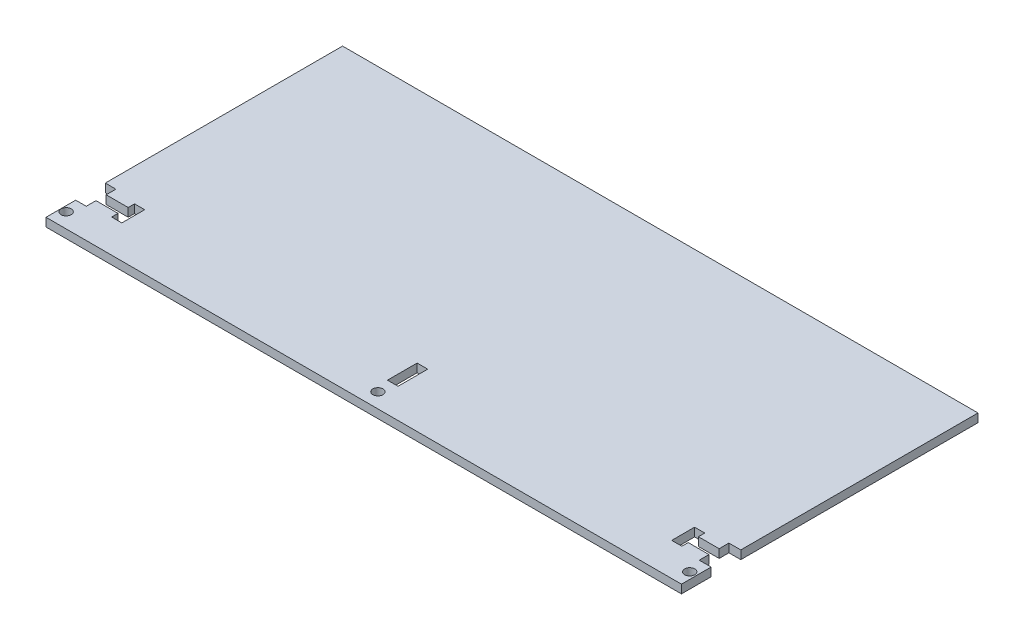
ISO-10303-21;
HEADER;
FILE_DESCRIPTION(('STEP AP214'),'2;1');
FILE_NAME('part.step','',(''),(''),'','','');
FILE_SCHEMA(('AUTOMOTIVE_DESIGN { 1 0 10303 214 1 1 1 1 }'));
ENDSEC;
DATA;
#1=APPLICATION_CONTEXT('core data for automotive mechanical design processes');
#2=APPLICATION_PROTOCOL_DEFINITION('international standard','automotive_design',2000,#1);
#3=PRODUCT_CONTEXT('',#1,'mechanical');
#4=PRODUCT('Part','Part','',(#3));
#5=PRODUCT_RELATED_PRODUCT_CATEGORY('part','',(#4));
#6=PRODUCT_DEFINITION_FORMATION('','',#4);
#7=PRODUCT_DEFINITION_CONTEXT('part definition',#1,'design');
#8=PRODUCT_DEFINITION('design','',#6,#7);
#9=PRODUCT_DEFINITION_SHAPE('','',#8);
#10=(LENGTH_UNIT() NAMED_UNIT(*) SI_UNIT(.MILLI.,.METRE.));
#11=(NAMED_UNIT(*) PLANE_ANGLE_UNIT() SI_UNIT($,.RADIAN.));
#12=(NAMED_UNIT(*) SI_UNIT($,.STERADIAN.) SOLID_ANGLE_UNIT());
#13=UNCERTAINTY_MEASURE_WITH_UNIT(LENGTH_MEASURE(1.E-05),#10,'distance_accuracy_value','');
#14=(GEOMETRIC_REPRESENTATION_CONTEXT(3) GLOBAL_UNCERTAINTY_ASSIGNED_CONTEXT((#13)) GLOBAL_UNIT_ASSIGNED_CONTEXT((#10,
#11,#12)) REPRESENTATION_CONTEXT('',''));
#15=CARTESIAN_POINT('',(0.,0.,0.));
#16=DIRECTION('',(0.,0.,1.));
#17=DIRECTION('',(1.,0.,0.));
#18=AXIS2_PLACEMENT_3D('',#15,#16,#17);
#19=CARTESIAN_POINT('',(96.647,2.54,0.));
#20=DIRECTION('',(1.,0.,0.));
#21=DIRECTION('',(0.,0.,-1.));
#22=AXIS2_PLACEMENT_3D('',#19,#20,#21);
#23=PLANE('',#22);
#24=DIRECTION('',(0.,0.,1.));
#25=VECTOR('',#24,1.);
#26=CARTESIAN_POINT('',(96.647,0.,0.));
#27=LINE('',#26,#25);
#28=CARTESIAN_POINT('',(96.647,0.,71.12));
#29=VERTEX_POINT('',#28);
#30=CARTESIAN_POINT('',(96.647,0.,80.01));
#31=VERTEX_POINT('',#30);
#32=EDGE_CURVE('E389',#29,#31,#27,.T.);
#33=ORIENTED_EDGE('',*,*,#32,.T.);
#34=DIRECTION('',(0.,-1.,0.));
#35=VECTOR('',#34,1.);
#36=CARTESIAN_POINT('',(96.647,2.54,80.01));
#37=LINE('',#36,#35);
#38=CARTESIAN_POINT('',(96.647,2.54,80.01));
#39=VERTEX_POINT('',#38);
#40=EDGE_CURVE('E11',#39,#31,#37,.T.);
#41=ORIENTED_EDGE('',*,*,#40,.F.);
#42=DIRECTION('',(0.,0.,1.));
#43=VECTOR('',#42,1.);
#44=CARTESIAN_POINT('',(96.647,2.54,0.));
#45=LINE('',#44,#43);
#46=CARTESIAN_POINT('',(96.647,2.54,71.12));
#47=VERTEX_POINT('',#46);
#48=EDGE_CURVE('E274',#47,#39,#45,.T.);
#49=ORIENTED_EDGE('',*,*,#48,.F.);
#50=DIRECTION('',(0.,-1.,0.));
#51=VECTOR('',#50,1.);
#52=CARTESIAN_POINT('',(96.647,2.54,71.12));
#53=LINE('',#52,#51);
#54=EDGE_CURVE('E405',#47,#29,#53,.T.);
#55=ORIENTED_EDGE('',*,*,#54,.T.);
#56=EDGE_LOOP('',(#33,#41,#49,#55));
#57=FACE_BOUND('',#56,.T.);
#58=ADVANCED_FACE('F41',(#57),#23,.F.);
#59=CARTESIAN_POINT('',(0.,2.54,80.01));
#60=DIRECTION('',(0.,0.,-1.));
#61=DIRECTION('',(-1.,0.,0.));
#62=AXIS2_PLACEMENT_3D('',#59,#60,#61);
#63=PLANE('',#62);
#64=DIRECTION('',(1.,0.,0.));
#65=VECTOR('',#64,1.);
#66=CARTESIAN_POINT('',(0.,0.,80.01));
#67=LINE('',#66,#65);
#68=CARTESIAN_POINT('',(93.472,0.,80.01));
#69=VERTEX_POINT('',#68);
#70=EDGE_CURVE('E263',#69,#31,#67,.T.);
#71=ORIENTED_EDGE('',*,*,#70,.F.);
#72=DIRECTION('',(0.,-1.,0.));
#73=VECTOR('',#72,1.);
#74=CARTESIAN_POINT('',(93.472,2.54,80.01));
#75=LINE('',#74,#73);
#76=CARTESIAN_POINT('',(93.472,2.54,80.01));
#77=VERTEX_POINT('',#76);
#78=EDGE_CURVE('E52',#77,#69,#75,.T.);
#79=ORIENTED_EDGE('',*,*,#78,.F.);
#80=DIRECTION('',(1.,0.,0.));
#81=VECTOR('',#80,1.);
#82=CARTESIAN_POINT('',(0.,2.54,80.01));
#83=LINE('',#82,#81);
#84=EDGE_CURVE('E261',#77,#39,#83,.T.);
#85=ORIENTED_EDGE('',*,*,#84,.T.);
#86=ORIENTED_EDGE('',*,*,#40,.T.);
#87=EDGE_LOOP('',(#71,#79,#85,#86));
#88=FACE_BOUND('',#87,.T.);
#89=ADVANCED_FACE('F260',(#88),#63,.T.);
#90=CARTESIAN_POINT('',(93.472,2.54,0.));
#91=DIRECTION('',(1.,0.,0.));
#92=DIRECTION('',(0.,0.,-1.));
#93=AXIS2_PLACEMENT_3D('',#90,#91,#92);
#94=PLANE('',#93);
#95=DIRECTION('',(0.,0.,1.));
#96=VECTOR('',#95,1.);
#97=CARTESIAN_POINT('',(93.472,0.,0.));
#98=LINE('',#97,#96);
#99=CARTESIAN_POINT('',(93.472,0.,71.12));
#100=VERTEX_POINT('',#99);
#101=EDGE_CURVE('E395',#100,#69,#98,.T.);
#102=ORIENTED_EDGE('',*,*,#101,.F.);
#103=DIRECTION('',(0.,-1.,0.));
#104=VECTOR('',#103,1.);
#105=CARTESIAN_POINT('',(93.472,2.54,71.12));
#106=LINE('',#105,#104);
#107=CARTESIAN_POINT('',(93.472,2.54,71.12));
#108=VERTEX_POINT('',#107);
#109=EDGE_CURVE('E160',#108,#100,#106,.T.);
#110=ORIENTED_EDGE('',*,*,#109,.F.);
#111=DIRECTION('',(0.,0.,1.));
#112=VECTOR('',#111,1.);
#113=CARTESIAN_POINT('',(93.472,2.54,0.));
#114=LINE('',#113,#112);
#115=EDGE_CURVE('E272',#108,#77,#114,.T.);
#116=ORIENTED_EDGE('',*,*,#115,.T.);
#117=ORIENTED_EDGE('',*,*,#78,.T.);
#118=EDGE_LOOP('',(#102,#110,#116,#117));
#119=FACE_BOUND('',#118,.T.);
#120=ADVANCED_FACE('F278',(#119),#94,.T.);
#121=CARTESIAN_POINT('',(0.,2.54,88.9));
#122=DIRECTION('',(0.,0.,-1.));
#123=DIRECTION('',(-1.,0.,0.));
#124=AXIS2_PLACEMENT_3D('',#121,#122,#123);
#125=PLANE('',#124);
#126=DIRECTION('',(1.,0.,0.));
#127=VECTOR('',#126,1.);
#128=CARTESIAN_POINT('',(0.,0.,88.9));
#129=LINE('',#128,#127);
#130=CARTESIAN_POINT('',(0.,0.,88.9));
#131=VERTEX_POINT('',#130);
#132=CARTESIAN_POINT('',(190.5,0.,88.9));
#133=VERTEX_POINT('',#132);
#134=EDGE_CURVE('E294',#131,#133,#129,.T.);
#135=ORIENTED_EDGE('',*,*,#134,.T.);
#136=DIRECTION('',(0.,-1.,0.));
#137=VECTOR('',#136,1.);
#138=CARTESIAN_POINT('',(190.5,2.54,88.9));
#139=LINE('',#138,#137);
#140=CARTESIAN_POINT('',(190.5,2.54,88.9));
#141=VERTEX_POINT('',#140);
#142=EDGE_CURVE('E45',#141,#133,#139,.T.);
#143=ORIENTED_EDGE('',*,*,#142,.F.);
#144=DIRECTION('',(1.,0.,0.));
#145=VECTOR('',#144,1.);
#146=CARTESIAN_POINT('',(0.,2.54,88.9));
#147=LINE('',#146,#145);
#148=CARTESIAN_POINT('',(0.,2.54,88.9));
#149=VERTEX_POINT('',#148);
#150=EDGE_CURVE('E172',#149,#141,#147,.T.);
#151=ORIENTED_EDGE('',*,*,#150,.F.);
#152=DIRECTION('',(0.,-1.,0.));
#153=VECTOR('',#152,1.);
#154=CARTESIAN_POINT('',(0.,2.54,88.9));
#155=LINE('',#154,#153);
#156=EDGE_CURVE('E289',#149,#131,#155,.T.);
#157=ORIENTED_EDGE('',*,*,#156,.T.);
#158=EDGE_LOOP('',(#135,#143,#151,#157));
#159=FACE_BOUND('',#158,.T.);
#160=ADVANCED_FACE('F506',(#159),#125,.F.);
#161=CARTESIAN_POINT('',(190.5,2.54,0.));
#162=DIRECTION('',(1.,0.,0.));
#163=DIRECTION('',(0.,0.,-1.));
#164=AXIS2_PLACEMENT_3D('',#161,#162,#163);
#165=PLANE('',#164);
#166=DIRECTION('',(0.,0.,1.));
#167=VECTOR('',#166,1.);
#168=CARTESIAN_POINT('',(190.5,0.,0.));
#169=LINE('',#168,#167);
#170=CARTESIAN_POINT('',(190.5,0.,80.01));
#171=VERTEX_POINT('',#170);
#172=EDGE_CURVE('E298',#171,#133,#169,.T.);
#173=ORIENTED_EDGE('',*,*,#172,.F.);
#174=DIRECTION('',(0.,-1.,0.));
#175=VECTOR('',#174,1.);
#176=CARTESIAN_POINT('',(190.5,2.54,80.01));
#177=LINE('',#176,#175);
#178=CARTESIAN_POINT('',(190.5,2.54,80.01));
#179=VERTEX_POINT('',#178);
#180=EDGE_CURVE('E493',#179,#171,#177,.T.);
#181=ORIENTED_EDGE('',*,*,#180,.F.);
#182=DIRECTION('',(0.,0.,1.));
#183=VECTOR('',#182,1.);
#184=CARTESIAN_POINT('',(190.5,2.54,0.));
#185=LINE('',#184,#183);
#186=EDGE_CURVE('E503',#179,#141,#185,.T.);
#187=ORIENTED_EDGE('',*,*,#186,.T.);
#188=ORIENTED_EDGE('',*,*,#142,.T.);
#189=EDGE_LOOP('',(#173,#181,#187,#188));
#190=FACE_BOUND('',#189,.T.);
#191=ADVANCED_FACE('F502',(#190),#165,.T.);
#192=CARTESIAN_POINT('',(0.,2.54,80.01));
#193=DIRECTION('',(0.,0.,-1.));
#194=DIRECTION('',(-1.,0.,0.));
#195=AXIS2_PLACEMENT_3D('',#192,#193,#194);
#196=PLANE('',#195);
#197=DIRECTION('',(1.,0.,0.));
#198=VECTOR('',#197,1.);
#199=CARTESIAN_POINT('',(0.,0.,80.01));
#200=LINE('',#199,#198);
#201=CARTESIAN_POINT('',(186.944,0.,80.01));
#202=VERTEX_POINT('',#201);
#203=EDGE_CURVE('E302',#202,#171,#200,.T.);
#204=ORIENTED_EDGE('',*,*,#203,.F.);
#205=DIRECTION('',(0.,-1.,0.));
#206=VECTOR('',#205,1.);
#207=CARTESIAN_POINT('',(186.944,2.54,80.01));
#208=LINE('',#207,#206);
#209=CARTESIAN_POINT('',(186.944,2.54,80.01));
#210=VERTEX_POINT('',#209);
#211=EDGE_CURVE('E491',#210,#202,#208,.T.);
#212=ORIENTED_EDGE('',*,*,#211,.F.);
#213=DIRECTION('',(1.,0.,0.));
#214=VECTOR('',#213,1.);
#215=CARTESIAN_POINT('',(0.,2.54,80.01));
#216=LINE('',#215,#214);
#217=EDGE_CURVE('E516',#210,#179,#216,.T.);
#218=ORIENTED_EDGE('',*,*,#217,.T.);
#219=ORIENTED_EDGE('',*,*,#180,.T.);
#220=EDGE_LOOP('',(#204,#212,#218,#219));
#221=FACE_BOUND('',#220,.T.);
#222=ADVANCED_FACE('F514',(#221),#196,.T.);
#223=CARTESIAN_POINT('',(186.944,2.54,0.));
#224=DIRECTION('',(1.,0.,0.));
#225=DIRECTION('',(0.,0.,-1.));
#226=AXIS2_PLACEMENT_3D('',#223,#224,#225);
#227=PLANE('',#226);
#228=DIRECTION('',(0.,0.,1.));
#229=VECTOR('',#228,1.);
#230=CARTESIAN_POINT('',(186.944,0.,0.));
#231=LINE('',#230,#229);
#232=CARTESIAN_POINT('',(186.944,0.,77.089));
#233=VERTEX_POINT('',#232);
#234=EDGE_CURVE('E306',#233,#202,#231,.T.);
#235=ORIENTED_EDGE('',*,*,#234,.F.);
#236=DIRECTION('',(0.,-1.,0.));
#237=VECTOR('',#236,1.);
#238=CARTESIAN_POINT('',(186.944,2.54,77.089));
#239=LINE('',#238,#237);
#240=CARTESIAN_POINT('',(186.944,2.54,77.089));
#241=VERTEX_POINT('',#240);
#242=EDGE_CURVE('E488',#241,#233,#239,.T.);
#243=ORIENTED_EDGE('',*,*,#242,.F.);
#244=DIRECTION('',(0.,0.,1.));
#245=VECTOR('',#244,1.);
#246=CARTESIAN_POINT('',(186.944,2.54,0.));
#247=LINE('',#246,#245);
#248=EDGE_CURVE('E521',#241,#210,#247,.T.);
#249=ORIENTED_EDGE('',*,*,#248,.T.);
#250=ORIENTED_EDGE('',*,*,#211,.T.);
#251=EDGE_LOOP('',(#235,#243,#249,#250));
#252=FACE_BOUND('',#251,.T.);
#253=ADVANCED_FACE('F524',(#252),#227,.T.);
#254=CARTESIAN_POINT('',(1.1083969999136E-13,2.54,77.0890000000002));
#255=DIRECTION('',(0.,0.,1.));
#256=DIRECTION('',(1.,0.,0.));
#257=AXIS2_PLACEMENT_3D('',#254,#255,#256);
#258=PLANE('',#257);
#259=DIRECTION('',(-1.,0.,0.));
#260=VECTOR('',#259,1.);
#261=CARTESIAN_POINT('',(1.1083969999136E-13,0.,77.0890000000002));
#262=LINE('',#261,#260);
#263=CARTESIAN_POINT('',(180.721,0.,77.089));
#264=VERTEX_POINT('',#263);
#265=EDGE_CURVE('E310',#233,#264,#262,.T.);
#266=ORIENTED_EDGE('',*,*,#265,.T.);
#267=DIRECTION('',(0.,-1.,0.));
#268=VECTOR('',#267,1.);
#269=CARTESIAN_POINT('',(180.721,2.54,77.089));
#270=LINE('',#269,#268);
#271=CARTESIAN_POINT('',(180.721,2.54,77.089));
#272=VERTEX_POINT('',#271);
#273=EDGE_CURVE('E484',#272,#264,#270,.T.);
#274=ORIENTED_EDGE('',*,*,#273,.F.);
#275=DIRECTION('',(-1.,0.,0.));
#276=VECTOR('',#275,1.);
#277=CARTESIAN_POINT('',(1.1083969999136E-13,2.54,77.0890000000002));
#278=LINE('',#277,#276);
#279=EDGE_CURVE('E527',#241,#272,#278,.T.);
#280=ORIENTED_EDGE('',*,*,#279,.F.);
#281=ORIENTED_EDGE('',*,*,#242,.T.);
#282=EDGE_LOOP('',(#266,#274,#280,#281));
#283=FACE_BOUND('',#282,.T.);
#284=ADVANCED_FACE('F733',(#283),#258,.F.);
#285=CARTESIAN_POINT('',(180.721,2.54,0.));
#286=DIRECTION('',(1.,0.,0.));
#287=DIRECTION('',(0.,0.,-1.));
#288=AXIS2_PLACEMENT_3D('',#285,#286,#287);
#289=PLANE('',#288);
#290=DIRECTION('',(0.,0.,1.));
#291=VECTOR('',#290,1.);
#292=CARTESIAN_POINT('',(180.721,0.,0.));
#293=LINE('',#292,#291);
#294=CARTESIAN_POINT('',(180.721,0.,78.994));
#295=VERTEX_POINT('',#294);
#296=EDGE_CURVE('E314',#264,#295,#293,.T.);
#297=ORIENTED_EDGE('',*,*,#296,.T.);
#298=DIRECTION('',(0.,-1.,0.));
#299=VECTOR('',#298,1.);
#300=CARTESIAN_POINT('',(180.721,2.54,78.994));
#301=LINE('',#300,#299);
#302=CARTESIAN_POINT('',(180.721,2.54,78.994));
#303=VERTEX_POINT('',#302);
#304=EDGE_CURVE('E480',#303,#295,#301,.T.);
#305=ORIENTED_EDGE('',*,*,#304,.F.);
#306=DIRECTION('',(0.,0.,1.));
#307=VECTOR('',#306,1.);
#308=CARTESIAN_POINT('',(180.721,2.54,0.));
#309=LINE('',#308,#307);
#310=EDGE_CURVE('E531',#272,#303,#309,.T.);
#311=ORIENTED_EDGE('',*,*,#310,.F.);
#312=ORIENTED_EDGE('',*,*,#273,.T.);
#313=EDGE_LOOP('',(#297,#305,#311,#312));
#314=FACE_BOUND('',#313,.T.);
#315=ADVANCED_FACE('F721',(#314),#289,.F.);
#316=CARTESIAN_POINT('',(3.59666000685859E-13,2.54,78.9940000000008));
#317=DIRECTION('',(0.,0.,1.));
#318=DIRECTION('',(1.,0.,0.));
#319=AXIS2_PLACEMENT_3D('',#316,#317,#318);
#320=PLANE('',#319);
#321=DIRECTION('',(-1.,0.,0.));
#322=VECTOR('',#321,1.);
#323=CARTESIAN_POINT('',(3.59666000685859E-13,0.,78.9940000000008));
#324=LINE('',#323,#322);
#325=CARTESIAN_POINT('',(177.673,0.,78.994));
#326=VERTEX_POINT('',#325);
#327=EDGE_CURVE('E317',#295,#326,#324,.T.);
#328=ORIENTED_EDGE('',*,*,#327,.T.);
#329=DIRECTION('',(0.,-1.,0.));
#330=VECTOR('',#329,1.);
#331=CARTESIAN_POINT('',(177.673,2.54,78.994));
#332=LINE('',#331,#330);
#333=CARTESIAN_POINT('',(177.673,2.54,78.994));
#334=VERTEX_POINT('',#333);
#335=EDGE_CURVE('E477',#334,#326,#332,.T.);
#336=ORIENTED_EDGE('',*,*,#335,.F.);
#337=DIRECTION('',(-1.,0.,0.));
#338=VECTOR('',#337,1.);
#339=CARTESIAN_POINT('',(3.59666000685859E-13,2.54,78.9940000000008));
#340=LINE('',#339,#338);
#341=EDGE_CURVE('E1025',#303,#334,#340,.T.);
#342=ORIENTED_EDGE('',*,*,#341,.F.);
#343=ORIENTED_EDGE('',*,*,#304,.T.);
#344=EDGE_LOOP('',(#328,#336,#342,#343));
#345=FACE_BOUND('',#344,.T.);
#346=ADVANCED_FACE('F728',(#345),#320,.F.);
#347=CARTESIAN_POINT('',(177.673,2.54,0.));
#348=DIRECTION('',(1.,0.,0.));
#349=DIRECTION('',(0.,0.,-1.));
#350=AXIS2_PLACEMENT_3D('',#347,#348,#349);
#351=PLANE('',#350);
#352=DIRECTION('',(0.,0.,1.));
#353=VECTOR('',#352,1.);
#354=CARTESIAN_POINT('',(177.673,0.,0.));
#355=LINE('',#354,#353);
#356=CARTESIAN_POINT('',(177.673,0.,72.1359999999999));
#357=VERTEX_POINT('',#356);
#358=EDGE_CURVE('E322',#357,#326,#355,.T.);
#359=ORIENTED_EDGE('',*,*,#358,.F.);
#360=DIRECTION('',(0.,-1.,0.));
#361=VECTOR('',#360,1.);
#362=CARTESIAN_POINT('',(177.673,2.54,72.1359999999999));
#363=LINE('',#362,#361);
#364=CARTESIAN_POINT('',(177.673,2.54,72.1359999999999));
#365=VERTEX_POINT('',#364);
#366=EDGE_CURVE('E474',#365,#357,#363,.T.);
#367=ORIENTED_EDGE('',*,*,#366,.F.);
#368=DIRECTION('',(0.,0.,1.));
#369=VECTOR('',#368,1.);
#370=CARTESIAN_POINT('',(177.673,2.54,0.));
#371=LINE('',#370,#369);
#372=EDGE_CURVE('E1031',#365,#334,#371,.T.);
#373=ORIENTED_EDGE('',*,*,#372,.T.);
#374=ORIENTED_EDGE('',*,*,#335,.T.);
#375=EDGE_LOOP('',(#359,#367,#373,#374));
#376=FACE_BOUND('',#375,.T.);
#377=ADVANCED_FACE('F724',(#376),#351,.T.);
#378=CARTESIAN_POINT('',(-3.28440978118269E-13,2.54,72.1359999999991));
#379=DIRECTION('',(0.,0.,1.));
#380=DIRECTION('',(1.,0.,0.));
#381=AXIS2_PLACEMENT_3D('',#378,#379,#380);
#382=PLANE('',#381);
#383=DIRECTION('',(-1.,0.,0.));
#384=VECTOR('',#383,1.);
#385=CARTESIAN_POINT('',(-3.28440978118269E-13,0.,72.1359999999991));
#386=LINE('',#385,#384);
#387=CARTESIAN_POINT('',(180.721,0.,72.1359999999999));
#388=VERTEX_POINT('',#387);
#389=EDGE_CURVE('E326',#388,#357,#386,.T.);
#390=ORIENTED_EDGE('',*,*,#389,.F.);
#391=DIRECTION('',(0.,-1.,0.));
#392=VECTOR('',#391,1.);
#393=CARTESIAN_POINT('',(180.721,2.54,72.1359999999999));
#394=LINE('',#393,#392);
#395=CARTESIAN_POINT('',(180.721,2.54,72.1359999999999));
#396=VERTEX_POINT('',#395);
#397=EDGE_CURVE('E471',#396,#388,#394,.T.);
#398=ORIENTED_EDGE('',*,*,#397,.F.);
#399=DIRECTION('',(-1.,0.,0.));
#400=VECTOR('',#399,1.);
#401=CARTESIAN_POINT('',(-3.28440978118269E-13,2.54,72.1359999999991));
#402=LINE('',#401,#400);
#403=EDGE_CURVE('E549',#396,#365,#402,.T.);
#404=ORIENTED_EDGE('',*,*,#403,.T.);
#405=ORIENTED_EDGE('',*,*,#366,.T.);
#406=EDGE_LOOP('',(#390,#398,#404,#405));
#407=FACE_BOUND('',#406,.T.);
#408=ADVANCED_FACE('F719',(#407),#382,.T.);
#409=CARTESIAN_POINT('',(180.721,0.,74.041));
#410=VERTEX_POINT('',#409);
#411=EDGE_CURVE('E318',#388,#410,#293,.T.);
#412=ORIENTED_EDGE('',*,*,#411,.T.);
#413=DIRECTION('',(0.,-1.,0.));
#414=VECTOR('',#413,1.);
#415=CARTESIAN_POINT('',(180.721,2.54,74.041));
#416=LINE('',#415,#414);
#417=CARTESIAN_POINT('',(180.721,2.54,74.041));
#418=VERTEX_POINT('',#417);
#419=EDGE_CURVE('E468',#418,#410,#416,.T.);
#420=ORIENTED_EDGE('',*,*,#419,.F.);
#421=EDGE_CURVE('E544',#396,#418,#309,.T.);
#422=ORIENTED_EDGE('',*,*,#421,.F.);
#423=ORIENTED_EDGE('',*,*,#397,.T.);
#424=EDGE_LOOP('',(#412,#420,#422,#423));
#425=FACE_BOUND('',#424,.T.);
#426=ADVANCED_FACE('F716',(#425),#289,.F.);
#427=CARTESIAN_POINT('',(-1.06457240683629E-13,2.54,74.0409999999998));
#428=DIRECTION('',(0.,0.,1.));
#429=DIRECTION('',(1.,0.,0.));
#430=AXIS2_PLACEMENT_3D('',#427,#428,#429);
#431=PLANE('',#430);
#432=DIRECTION('',(-1.,0.,0.));
#433=VECTOR('',#432,1.);
#434=CARTESIAN_POINT('',(-1.06457240683629E-13,0.,74.0409999999998));
#435=LINE('',#434,#433);
#436=CARTESIAN_POINT('',(186.944,0.,74.041));
#437=VERTEX_POINT('',#436);
#438=EDGE_CURVE('E330',#437,#410,#435,.T.);
#439=ORIENTED_EDGE('',*,*,#438,.F.);
#440=DIRECTION('',(0.,-1.,0.));
#441=VECTOR('',#440,1.);
#442=CARTESIAN_POINT('',(186.944,2.54,74.041));
#443=LINE('',#442,#441);
#444=CARTESIAN_POINT('',(186.944,2.54,74.041));
#445=VERTEX_POINT('',#444);
#446=EDGE_CURVE('E465',#445,#437,#443,.T.);
#447=ORIENTED_EDGE('',*,*,#446,.F.);
#448=DIRECTION('',(-1.,0.,0.));
#449=VECTOR('',#448,1.);
#450=CARTESIAN_POINT('',(-1.06457240683629E-13,2.54,74.0409999999998));
#451=LINE('',#450,#449);
#452=EDGE_CURVE('E536',#445,#418,#451,.T.);
#453=ORIENTED_EDGE('',*,*,#452,.T.);
#454=ORIENTED_EDGE('',*,*,#419,.T.);
#455=EDGE_LOOP('',(#439,#447,#453,#454));
#456=FACE_BOUND('',#455,.T.);
#457=ADVANCED_FACE('F713',(#456),#431,.T.);
#458=CARTESIAN_POINT('',(186.944,0.,71.12));
#459=VERTEX_POINT('',#458);
#460=EDGE_CURVE('E311',#459,#437,#231,.T.);
#461=ORIENTED_EDGE('',*,*,#460,.F.);
#462=DIRECTION('',(0.,-1.,0.));
#463=VECTOR('',#462,1.);
#464=CARTESIAN_POINT('',(186.944,2.54,71.12));
#465=LINE('',#464,#463);
#466=CARTESIAN_POINT('',(186.944,2.54,71.12));
#467=VERTEX_POINT('',#466);
#468=EDGE_CURVE('E462',#467,#459,#465,.T.);
#469=ORIENTED_EDGE('',*,*,#468,.F.);
#470=EDGE_CURVE('E529',#467,#445,#247,.T.);
#471=ORIENTED_EDGE('',*,*,#470,.T.);
#472=ORIENTED_EDGE('',*,*,#446,.T.);
#473=EDGE_LOOP('',(#461,#469,#471,#472));
#474=FACE_BOUND('',#473,.T.);
#475=ADVANCED_FACE('F709',(#474),#227,.T.);
#476=CARTESIAN_POINT('',(3.10862446895046E-13,2.54,71.1200000000008));
#477=DIRECTION('',(0.,0.,-1.));
#478=DIRECTION('',(-1.,0.,0.));
#479=AXIS2_PLACEMENT_3D('',#476,#477,#478);
#480=PLANE('',#479);
#481=DIRECTION('',(1.,0.,0.));
#482=VECTOR('',#481,1.);
#483=CARTESIAN_POINT('',(3.10862446895046E-13,0.,71.1200000000008));
#484=LINE('',#483,#482);
#485=CARTESIAN_POINT('',(190.5,0.,71.12));
#486=VERTEX_POINT('',#485);
#487=EDGE_CURVE('E334',#459,#486,#484,.T.);
#488=ORIENTED_EDGE('',*,*,#487,.T.);
#489=DIRECTION('',(0.,-1.,0.));
#490=VECTOR('',#489,1.);
#491=CARTESIAN_POINT('',(190.5,2.54,71.12));
#492=LINE('',#491,#490);
#493=CARTESIAN_POINT('',(190.5,2.54,71.12));
#494=VERTEX_POINT('',#493);
#495=EDGE_CURVE('E459',#494,#486,#492,.T.);
#496=ORIENTED_EDGE('',*,*,#495,.F.);
#497=DIRECTION('',(1.,0.,0.));
#498=VECTOR('',#497,1.);
#499=CARTESIAN_POINT('',(3.10862446895046E-13,2.54,71.1200000000008));
#500=LINE('',#499,#498);
#501=EDGE_CURVE('E535',#467,#494,#500,.T.);
#502=ORIENTED_EDGE('',*,*,#501,.F.);
#503=ORIENTED_EDGE('',*,*,#468,.T.);
#504=EDGE_LOOP('',(#488,#496,#502,#503));
#505=FACE_BOUND('',#504,.T.);
#506=ADVANCED_FACE('F705',(#505),#480,.F.);
#507=CARTESIAN_POINT('',(190.5,2.54,0.));
#508=DIRECTION('',(1.,0.,0.));
#509=DIRECTION('',(0.,0.,-1.));
#510=AXIS2_PLACEMENT_3D('',#507,#508,#509);
#511=PLANE('',#510);
#512=DIRECTION('',(0.,0.,1.));
#513=VECTOR('',#512,1.);
#514=CARTESIAN_POINT('',(190.5,0.,0.));
#515=LINE('',#514,#513);
#516=CARTESIAN_POINT('',(190.5,0.,0.));
#517=VERTEX_POINT('',#516);
#518=EDGE_CURVE('E338',#517,#486,#515,.T.);
#519=ORIENTED_EDGE('',*,*,#518,.F.);
#520=DIRECTION('',(0.,-1.,0.));
#521=VECTOR('',#520,1.);
#522=CARTESIAN_POINT('',(190.5,2.54,0.));
#523=LINE('',#522,#521);
#524=CARTESIAN_POINT('',(190.5,2.54,0.));
#525=VERTEX_POINT('',#524);
#526=EDGE_CURVE('E456',#525,#517,#523,.T.);
#527=ORIENTED_EDGE('',*,*,#526,.F.);
#528=DIRECTION('',(0.,0.,1.));
#529=VECTOR('',#528,1.);
#530=CARTESIAN_POINT('',(190.5,2.54,0.));
#531=LINE('',#530,#529);
#532=EDGE_CURVE('E541',#525,#494,#531,.T.);
#533=ORIENTED_EDGE('',*,*,#532,.T.);
#534=ORIENTED_EDGE('',*,*,#495,.T.);
#535=EDGE_LOOP('',(#519,#527,#533,#534));
#536=FACE_BOUND('',#535,.T.);
#537=ADVANCED_FACE('F701',(#536),#511,.T.);
#538=CARTESIAN_POINT('',(0.,2.54,0.));
#539=DIRECTION('',(0.,0.,-1.));
#540=DIRECTION('',(-1.,0.,0.));
#541=AXIS2_PLACEMENT_3D('',#538,#539,#540);
#542=PLANE('',#541);
#543=DIRECTION('',(1.,0.,0.));
#544=VECTOR('',#543,1.);
#545=CARTESIAN_POINT('',(0.,0.,0.));
#546=LINE('',#545,#544);
#547=CARTESIAN_POINT('',(0.,0.,0.));
#548=VERTEX_POINT('',#547);
#549=EDGE_CURVE('E342',#548,#517,#546,.T.);
#550=ORIENTED_EDGE('',*,*,#549,.F.);
#551=DIRECTION('',(0.,-1.,0.));
#552=VECTOR('',#551,1.);
#553=CARTESIAN_POINT('',(0.,2.54,0.));
#554=LINE('',#553,#552);
#555=CARTESIAN_POINT('',(0.,2.54,0.));
#556=VERTEX_POINT('',#555);
#557=EDGE_CURVE('E453',#556,#548,#554,.T.);
#558=ORIENTED_EDGE('',*,*,#557,.F.);
#559=DIRECTION('',(1.,0.,0.));
#560=VECTOR('',#559,1.);
#561=CARTESIAN_POINT('',(0.,2.54,0.));
#562=LINE('',#561,#560);
#563=EDGE_CURVE('E557',#556,#525,#562,.T.);
#564=ORIENTED_EDGE('',*,*,#563,.T.);
#565=ORIENTED_EDGE('',*,*,#526,.T.);
#566=EDGE_LOOP('',(#550,#558,#564,#565));
#567=FACE_BOUND('',#566,.T.);
#568=ADVANCED_FACE('F698',(#567),#542,.T.);
#569=CARTESIAN_POINT('',(0.,2.54,0.));
#570=DIRECTION('',(1.,0.,0.));
#571=DIRECTION('',(0.,0.,-1.));
#572=AXIS2_PLACEMENT_3D('',#569,#570,#571);
#573=PLANE('',#572);
#574=DIRECTION('',(0.,0.,1.));
#575=VECTOR('',#574,1.);
#576=CARTESIAN_POINT('',(0.,0.,0.));
#577=LINE('',#576,#575);
#578=CARTESIAN_POINT('',(0.,0.,71.12));
#579=VERTEX_POINT('',#578);
#580=EDGE_CURVE('E346',#548,#579,#577,.T.);
#581=ORIENTED_EDGE('',*,*,#580,.T.);
#582=DIRECTION('',(0.,-1.,0.));
#583=VECTOR('',#582,1.);
#584=CARTESIAN_POINT('',(0.,2.54,71.12));
#585=LINE('',#584,#583);
#586=CARTESIAN_POINT('',(0.,2.54,71.12));
#587=VERTEX_POINT('',#586);
#588=EDGE_CURVE('E449',#587,#579,#585,.T.);
#589=ORIENTED_EDGE('',*,*,#588,.F.);
#590=DIRECTION('',(0.,0.,1.));
#591=VECTOR('',#590,1.);
#592=CARTESIAN_POINT('',(0.,2.54,0.));
#593=LINE('',#592,#591);
#594=EDGE_CURVE('E561',#556,#587,#593,.T.);
#595=ORIENTED_EDGE('',*,*,#594,.F.);
#596=ORIENTED_EDGE('',*,*,#557,.T.);
#597=EDGE_LOOP('',(#581,#589,#595,#596));
#598=FACE_BOUND('',#597,.T.);
#599=ADVANCED_FACE('F667',(#598),#573,.F.);
#600=CARTESIAN_POINT('',(3.10862446895044E-13,2.54,71.12));
#601=DIRECTION('',(0.,0.,-1.));
#602=DIRECTION('',(-1.,0.,0.));
#603=AXIS2_PLACEMENT_3D('',#600,#601,#602);
#604=PLANE('',#603);
#605=DIRECTION('',(1.,0.,0.));
#606=VECTOR('',#605,1.);
#607=CARTESIAN_POINT('',(3.10862446895044E-13,0.,71.12));
#608=LINE('',#607,#606);
#609=CARTESIAN_POINT('',(3.17500000000001,0.,71.12));
#610=VERTEX_POINT('',#609);
#611=EDGE_CURVE('E349',#579,#610,#608,.T.);
#612=ORIENTED_EDGE('',*,*,#611,.T.);
#613=DIRECTION('',(0.,-1.,0.));
#614=VECTOR('',#613,1.);
#615=CARTESIAN_POINT('',(3.17500000000001,2.54,71.12));
#616=LINE('',#615,#614);
#617=CARTESIAN_POINT('',(3.17500000000001,2.54,71.12));
#618=VERTEX_POINT('',#617);
#619=EDGE_CURVE('E445',#618,#610,#616,.T.);
#620=ORIENTED_EDGE('',*,*,#619,.F.);
#621=DIRECTION('',(1.,0.,0.));
#622=VECTOR('',#621,1.);
#623=CARTESIAN_POINT('',(3.10862446895044E-13,2.54,71.12));
#624=LINE('',#623,#622);
#625=EDGE_CURVE('E564',#587,#618,#624,.T.);
#626=ORIENTED_EDGE('',*,*,#625,.F.);
#627=ORIENTED_EDGE('',*,*,#588,.T.);
#628=EDGE_LOOP('',(#612,#620,#626,#627));
#629=FACE_BOUND('',#628,.T.);
#630=ADVANCED_FACE('F694',(#629),#604,.F.);
#631=CARTESIAN_POINT('',(3.17499999999994,2.54,0.));
#632=DIRECTION('',(1.,0.,0.));
#633=DIRECTION('',(0.,0.,-1.));
#634=AXIS2_PLACEMENT_3D('',#631,#632,#633);
#635=PLANE('',#634);
#636=DIRECTION('',(0.,0.,1.));
#637=VECTOR('',#636,1.);
#638=CARTESIAN_POINT('',(3.17499999999994,0.,0.));
#639=LINE('',#638,#637);
#640=CARTESIAN_POINT('',(3.17500000000001,0.,74.041));
#641=VERTEX_POINT('',#640);
#642=EDGE_CURVE('E353',#610,#641,#639,.T.);
#643=ORIENTED_EDGE('',*,*,#642,.T.);
#644=DIRECTION('',(0.,-1.,0.));
#645=VECTOR('',#644,1.);
#646=CARTESIAN_POINT('',(3.17500000000001,2.54,74.041));
#647=LINE('',#646,#645);
#648=CARTESIAN_POINT('',(3.17500000000001,2.54,74.041));
#649=VERTEX_POINT('',#648);
#650=EDGE_CURVE('E441',#649,#641,#647,.T.);
#651=ORIENTED_EDGE('',*,*,#650,.F.);
#652=DIRECTION('',(0.,0.,1.));
#653=VECTOR('',#652,1.);
#654=CARTESIAN_POINT('',(3.17499999999994,2.54,0.));
#655=LINE('',#654,#653);
#656=EDGE_CURVE('E568',#618,#649,#655,.T.);
#657=ORIENTED_EDGE('',*,*,#656,.F.);
#658=ORIENTED_EDGE('',*,*,#619,.T.);
#659=EDGE_LOOP('',(#643,#651,#657,#658));
#660=FACE_BOUND('',#659,.T.);
#661=ADVANCED_FACE('F672',(#660),#635,.F.);
#662=CARTESIAN_POINT('',(1.06457240683629E-13,2.54,74.041));
#663=DIRECTION('',(0.,0.,-1.));
#664=DIRECTION('',(-1.,0.,0.));
#665=AXIS2_PLACEMENT_3D('',#662,#663,#664);
#666=PLANE('',#665);
#667=DIRECTION('',(1.,0.,0.));
#668=VECTOR('',#667,1.);
#669=CARTESIAN_POINT('',(1.06457240683629E-13,0.,74.041));
#670=LINE('',#669,#668);
#671=CARTESIAN_POINT('',(9.77900000000001,0.,74.041));
#672=VERTEX_POINT('',#671);
#673=EDGE_CURVE('E356',#641,#672,#670,.T.);
#674=ORIENTED_EDGE('',*,*,#673,.T.);
#675=DIRECTION('',(0.,-1.,0.));
#676=VECTOR('',#675,1.);
#677=CARTESIAN_POINT('',(9.77900000000001,2.54,74.041));
#678=LINE('',#677,#676);
#679=CARTESIAN_POINT('',(9.77900000000001,2.54,74.041));
#680=VERTEX_POINT('',#679);
#681=EDGE_CURVE('E438',#680,#672,#678,.T.);
#682=ORIENTED_EDGE('',*,*,#681,.F.);
#683=DIRECTION('',(1.,0.,0.));
#684=VECTOR('',#683,1.);
#685=CARTESIAN_POINT('',(1.06457240683629E-13,2.54,74.041));
#686=LINE('',#685,#684);
#687=EDGE_CURVE('E571',#649,#680,#686,.T.);
#688=ORIENTED_EDGE('',*,*,#687,.F.);
#689=ORIENTED_EDGE('',*,*,#650,.T.);
#690=EDGE_LOOP('',(#674,#682,#688,#689));
#691=FACE_BOUND('',#690,.T.);
#692=ADVANCED_FACE('F690',(#691),#666,.F.);
#693=CARTESIAN_POINT('',(9.77899999999999,2.54,0.));
#694=DIRECTION('',(1.,0.,0.));
#695=DIRECTION('',(0.,0.,-1.));
#696=AXIS2_PLACEMENT_3D('',#693,#694,#695);
#697=PLANE('',#696);
#698=DIRECTION('',(0.,0.,1.));
#699=VECTOR('',#698,1.);
#700=CARTESIAN_POINT('',(9.77899999999999,0.,0.));
#701=LINE('',#700,#699);
#702=CARTESIAN_POINT('',(9.77900000000001,0.,72.136));
#703=VERTEX_POINT('',#702);
#704=EDGE_CURVE('E361',#703,#672,#701,.T.);
#705=ORIENTED_EDGE('',*,*,#704,.F.);
#706=DIRECTION('',(0.,-1.,0.));
#707=VECTOR('',#706,1.);
#708=CARTESIAN_POINT('',(9.77900000000001,2.54,72.136));
#709=LINE('',#708,#707);
#710=CARTESIAN_POINT('',(9.77900000000001,2.54,72.136));
#711=VERTEX_POINT('',#710);
#712=EDGE_CURVE('E435',#711,#703,#709,.T.);
#713=ORIENTED_EDGE('',*,*,#712,.F.);
#714=DIRECTION('',(0.,0.,1.));
#715=VECTOR('',#714,1.);
#716=CARTESIAN_POINT('',(9.77899999999999,2.54,0.));
#717=LINE('',#716,#715);
#718=EDGE_CURVE('E575',#711,#680,#717,.T.);
#719=ORIENTED_EDGE('',*,*,#718,.T.);
#720=ORIENTED_EDGE('',*,*,#681,.T.);
#721=EDGE_LOOP('',(#705,#713,#719,#720));
#722=FACE_BOUND('',#721,.T.);
#723=ADVANCED_FACE('F678',(#722),#697,.T.);
#724=CARTESIAN_POINT('',(0.,2.54,72.136));
#725=DIRECTION('',(0.,0.,-1.));
#726=DIRECTION('',(-1.,0.,0.));
#727=AXIS2_PLACEMENT_3D('',#724,#725,#726);
#728=PLANE('',#727);
#729=DIRECTION('',(1.,0.,0.));
#730=VECTOR('',#729,1.);
#731=CARTESIAN_POINT('',(0.,0.,72.136));
#732=LINE('',#731,#730);
#733=CARTESIAN_POINT('',(12.827,0.,72.136));
#734=VERTEX_POINT('',#733);
#735=EDGE_CURVE('E365',#703,#734,#732,.T.);
#736=ORIENTED_EDGE('',*,*,#735,.T.);
#737=DIRECTION('',(0.,-1.,0.));
#738=VECTOR('',#737,1.);
#739=CARTESIAN_POINT('',(12.827,2.54,72.136));
#740=LINE('',#739,#738);
#741=CARTESIAN_POINT('',(12.827,2.54,72.136));
#742=VERTEX_POINT('',#741);
#743=EDGE_CURVE('E431',#742,#734,#740,.T.);
#744=ORIENTED_EDGE('',*,*,#743,.F.);
#745=DIRECTION('',(1.,0.,0.));
#746=VECTOR('',#745,1.);
#747=CARTESIAN_POINT('',(0.,2.54,72.136));
#748=LINE('',#747,#746);
#749=EDGE_CURVE('E579',#711,#742,#748,.T.);
#750=ORIENTED_EDGE('',*,*,#749,.F.);
#751=ORIENTED_EDGE('',*,*,#712,.T.);
#752=EDGE_LOOP('',(#736,#744,#750,#751));
#753=FACE_BOUND('',#752,.T.);
#754=ADVANCED_FACE('F685',(#753),#728,.F.);
#755=CARTESIAN_POINT('',(12.827,2.54,0.));
#756=DIRECTION('',(1.,0.,0.));
#757=DIRECTION('',(0.,0.,-1.));
#758=AXIS2_PLACEMENT_3D('',#755,#756,#757);
#759=PLANE('',#758);
#760=DIRECTION('',(0.,0.,1.));
#761=VECTOR('',#760,1.);
#762=CARTESIAN_POINT('',(12.827,0.,0.));
#763=LINE('',#762,#761);
#764=CARTESIAN_POINT('',(12.827,0.,78.994));
#765=VERTEX_POINT('',#764);
#766=EDGE_CURVE('E369',#734,#765,#763,.T.);
#767=ORIENTED_EDGE('',*,*,#766,.T.);
#768=DIRECTION('',(0.,-1.,0.));
#769=VECTOR('',#768,1.);
#770=CARTESIAN_POINT('',(12.827,2.54,78.994));
#771=LINE('',#770,#769);
#772=CARTESIAN_POINT('',(12.827,2.54,78.994));
#773=VERTEX_POINT('',#772);
#774=EDGE_CURVE('E428',#773,#765,#771,.T.);
#775=ORIENTED_EDGE('',*,*,#774,.F.);
#776=DIRECTION('',(0.,0.,1.));
#777=VECTOR('',#776,1.);
#778=CARTESIAN_POINT('',(12.827,2.54,0.));
#779=LINE('',#778,#777);
#780=EDGE_CURVE('E583',#742,#773,#779,.T.);
#781=ORIENTED_EDGE('',*,*,#780,.F.);
#782=ORIENTED_EDGE('',*,*,#743,.T.);
#783=EDGE_LOOP('',(#767,#775,#781,#782));
#784=FACE_BOUND('',#783,.T.);
#785=ADVANCED_FACE('F681',(#784),#759,.F.);
#786=CARTESIAN_POINT('',(0.,2.54,78.994));
#787=DIRECTION('',(0.,0.,-1.));
#788=DIRECTION('',(-1.,0.,0.));
#789=AXIS2_PLACEMENT_3D('',#786,#787,#788);
#790=PLANE('',#789);
#791=DIRECTION('',(1.,0.,0.));
#792=VECTOR('',#791,1.);
#793=CARTESIAN_POINT('',(0.,0.,78.994));
#794=LINE('',#793,#792);
#795=CARTESIAN_POINT('',(9.77900000000002,0.,78.994));
#796=VERTEX_POINT('',#795);
#797=EDGE_CURVE('E373',#796,#765,#794,.T.);
#798=ORIENTED_EDGE('',*,*,#797,.F.);
#799=DIRECTION('',(0.,-1.,0.));
#800=VECTOR('',#799,1.);
#801=CARTESIAN_POINT('',(9.77900000000002,2.54,78.994));
#802=LINE('',#801,#800);
#803=CARTESIAN_POINT('',(9.77900000000002,2.54,78.994));
#804=VERTEX_POINT('',#803);
#805=EDGE_CURVE('E425',#804,#796,#802,.T.);
#806=ORIENTED_EDGE('',*,*,#805,.F.);
#807=DIRECTION('',(1.,0.,0.));
#808=VECTOR('',#807,1.);
#809=CARTESIAN_POINT('',(0.,2.54,78.994));
#810=LINE('',#809,#808);
#811=EDGE_CURVE('E586',#804,#773,#810,.T.);
#812=ORIENTED_EDGE('',*,*,#811,.T.);
#813=ORIENTED_EDGE('',*,*,#774,.T.);
#814=EDGE_LOOP('',(#798,#806,#812,#813));
#815=FACE_BOUND('',#814,.T.);
#816=ADVANCED_FACE('F677',(#815),#790,.T.);
#817=CARTESIAN_POINT('',(9.77900000000001,0.,77.089));
#818=VERTEX_POINT('',#817);
#819=EDGE_CURVE('E366',#818,#796,#701,.T.);
#820=ORIENTED_EDGE('',*,*,#819,.F.);
#821=DIRECTION('',(0.,-1.,0.));
#822=VECTOR('',#821,1.);
#823=CARTESIAN_POINT('',(9.77900000000001,2.54,77.089));
#824=LINE('',#823,#822);
#825=CARTESIAN_POINT('',(9.77900000000001,2.54,77.089));
#826=VERTEX_POINT('',#825);
#827=EDGE_CURVE('E422',#826,#818,#824,.T.);
#828=ORIENTED_EDGE('',*,*,#827,.F.);
#829=EDGE_CURVE('E580',#826,#804,#717,.T.);
#830=ORIENTED_EDGE('',*,*,#829,.T.);
#831=ORIENTED_EDGE('',*,*,#805,.T.);
#832=EDGE_LOOP('',(#820,#828,#830,#831));
#833=FACE_BOUND('',#832,.T.);
#834=ADVANCED_FACE('F609',(#833),#697,.T.);
#835=CARTESIAN_POINT('',(0.,2.54,77.089));
#836=DIRECTION('',(0.,0.,-1.));
#837=DIRECTION('',(-1.,0.,0.));
#838=AXIS2_PLACEMENT_3D('',#835,#836,#837);
#839=PLANE('',#838);
#840=DIRECTION('',(1.,0.,0.));
#841=VECTOR('',#840,1.);
#842=CARTESIAN_POINT('',(0.,0.,77.089));
#843=LINE('',#842,#841);
#844=CARTESIAN_POINT('',(3.17500000000001,0.,77.089));
#845=VERTEX_POINT('',#844);
#846=EDGE_CURVE('E377',#845,#818,#843,.T.);
#847=ORIENTED_EDGE('',*,*,#846,.F.);
#848=DIRECTION('',(0.,-1.,0.));
#849=VECTOR('',#848,1.);
#850=CARTESIAN_POINT('',(3.17500000000001,2.54,77.089));
#851=LINE('',#850,#849);
#852=CARTESIAN_POINT('',(3.17500000000001,2.54,77.089));
#853=VERTEX_POINT('',#852);
#854=EDGE_CURVE('E419',#853,#845,#851,.T.);
#855=ORIENTED_EDGE('',*,*,#854,.F.);
#856=DIRECTION('',(1.,0.,0.));
#857=VECTOR('',#856,1.);
#858=CARTESIAN_POINT('',(0.,2.54,77.089));
#859=LINE('',#858,#857);
#860=EDGE_CURVE('E590',#853,#826,#859,.T.);
#861=ORIENTED_EDGE('',*,*,#860,.T.);
#862=ORIENTED_EDGE('',*,*,#827,.T.);
#863=EDGE_LOOP('',(#847,#855,#861,#862));
#864=FACE_BOUND('',#863,.T.);
#865=ADVANCED_FACE('F615',(#864),#839,.T.);
#866=CARTESIAN_POINT('',(3.17500000000002,0.,80.01));
#867=VERTEX_POINT('',#866);
#868=EDGE_CURVE('E357',#845,#867,#639,.T.);
#869=ORIENTED_EDGE('',*,*,#868,.T.);
#870=DIRECTION('',(0.,-1.,0.));
#871=VECTOR('',#870,1.);
#872=CARTESIAN_POINT('',(3.17500000000002,2.54,80.01));
#873=LINE('',#872,#871);
#874=CARTESIAN_POINT('',(3.17500000000002,2.54,80.01));
#875=VERTEX_POINT('',#874);
#876=EDGE_CURVE('E416',#875,#867,#873,.T.);
#877=ORIENTED_EDGE('',*,*,#876,.F.);
#878=EDGE_CURVE('E572',#853,#875,#655,.T.);
#879=ORIENTED_EDGE('',*,*,#878,.F.);
#880=ORIENTED_EDGE('',*,*,#854,.T.);
#881=EDGE_LOOP('',(#869,#877,#879,#880));
#882=FACE_BOUND('',#881,.T.);
#883=ADVANCED_FACE('F621',(#882),#635,.F.);
#884=CARTESIAN_POINT('',(0.,2.54,80.01));
#885=DIRECTION('',(0.,0.,-1.));
#886=DIRECTION('',(-1.,0.,0.));
#887=AXIS2_PLACEMENT_3D('',#884,#885,#886);
#888=PLANE('',#887);
#889=DIRECTION('',(1.,0.,0.));
#890=VECTOR('',#889,1.);
#891=CARTESIAN_POINT('',(0.,0.,80.01));
#892=LINE('',#891,#890);
#893=CARTESIAN_POINT('',(0.,0.,80.01));
#894=VERTEX_POINT('',#893);
#895=EDGE_CURVE('E381',#894,#867,#892,.T.);
#896=ORIENTED_EDGE('',*,*,#895,.F.);
#897=DIRECTION('',(0.,-1.,0.));
#898=VECTOR('',#897,1.);
#899=CARTESIAN_POINT('',(0.,2.54,80.01));
#900=LINE('',#899,#898);
#901=CARTESIAN_POINT('',(0.,2.54,80.01));
#902=VERTEX_POINT('',#901);
#903=EDGE_CURVE('E413',#902,#894,#900,.T.);
#904=ORIENTED_EDGE('',*,*,#903,.F.);
#905=DIRECTION('',(1.,0.,0.));
#906=VECTOR('',#905,1.);
#907=CARTESIAN_POINT('',(0.,2.54,80.01));
#908=LINE('',#907,#906);
#909=EDGE_CURVE('E594',#902,#875,#908,.T.);
#910=ORIENTED_EDGE('',*,*,#909,.T.);
#911=ORIENTED_EDGE('',*,*,#876,.T.);
#912=EDGE_LOOP('',(#896,#904,#910,#911));
#913=FACE_BOUND('',#912,.T.);
#914=ADVANCED_FACE('F626',(#913),#888,.T.);
#915=CARTESIAN_POINT('',(3.10862446895046E-13,2.54,71.1200000000004));
#916=DIRECTION('',(0.,0.,-1.));
#917=DIRECTION('',(-1.,0.,0.));
#918=AXIS2_PLACEMENT_3D('',#915,#916,#917);
#919=PLANE('',#918);
#920=DIRECTION('',(1.,0.,0.));
#921=VECTOR('',#920,1.);
#922=CARTESIAN_POINT('',(3.10862446895046E-13,0.,71.1200000000004));
#923=LINE('',#922,#921);
#924=EDGE_CURVE('E163',#100,#29,#923,.T.);
#925=ORIENTED_EDGE('',*,*,#924,.T.);
#926=ORIENTED_EDGE('',*,*,#54,.F.);
#927=DIRECTION('',(1.,0.,0.));
#928=VECTOR('',#927,1.);
#929=CARTESIAN_POINT('',(3.10862446895046E-13,2.54,71.1200000000004));
#930=LINE('',#929,#928);
#931=EDGE_CURVE('E61',#108,#47,#930,.T.);
#932=ORIENTED_EDGE('',*,*,#931,.F.);
#933=ORIENTED_EDGE('',*,*,#109,.T.);
#934=EDGE_LOOP('',(#925,#926,#932,#933));
#935=FACE_BOUND('',#934,.T.);
#936=ADVANCED_FACE('F663',(#935),#919,.F.);
#937=CARTESIAN_POINT('',(1.58750000000002,2.54,84.455));
#938=DIRECTION('',(0.,-1.,0.));
#939=DIRECTION('',(0.,0.,-1.));
#940=AXIS2_PLACEMENT_3D('',#937,#938,#939);
#941=CYLINDRICAL_SURFACE('',#940,1.524);
#942=CARTESIAN_POINT('',(1.58750000000002,2.54,84.455));
#943=DIRECTION('',(0.,1.,0.));
#944=DIRECTION('',(0.,0.,1.));
#945=AXIS2_PLACEMENT_3D('',#942,#943,#944);
#946=CIRCLE('',#945,1.524);
#947=CARTESIAN_POINT('',(1.58750000000002,2.54,85.979));
#948=VERTEX_POINT('',#947);
#949=EDGE_CURVE('E598',#948,#948,#946,.T.);
#950=ORIENTED_EDGE('',*,*,#949,.T.);
#951=EDGE_LOOP('',(#950));
#952=FACE_BOUND('',#951,.T.);
#953=CARTESIAN_POINT('',(1.58750000000002,0.,84.455));
#954=DIRECTION('',(0.,1.,0.));
#955=DIRECTION('',(0.,0.,1.));
#956=AXIS2_PLACEMENT_3D('',#953,#954,#955);
#957=CIRCLE('',#956,1.524);
#958=CARTESIAN_POINT('',(1.58750000000002,0.,85.979));
#959=VERTEX_POINT('',#958);
#960=EDGE_CURVE('E385',#959,#959,#957,.T.);
#961=ORIENTED_EDGE('',*,*,#960,.F.);
#962=EDGE_LOOP('',(#961));
#963=FACE_BOUND('',#962,.T.);
#964=ADVANCED_FACE('F660',(#952,#963),#941,.F.);
#965=EDGE_CURVE('E350',#894,#131,#577,.T.);
#966=ORIENTED_EDGE('',*,*,#965,.T.);
#967=ORIENTED_EDGE('',*,*,#156,.F.);
#968=EDGE_CURVE('E565',#902,#149,#593,.T.);
#969=ORIENTED_EDGE('',*,*,#968,.F.);
#970=ORIENTED_EDGE('',*,*,#903,.T.);
#971=EDGE_LOOP('',(#966,#967,#969,#970));
#972=FACE_BOUND('',#971,.T.);
#973=ADVANCED_FACE('F628',(#972),#573,.F.);
#974=CARTESIAN_POINT('',(95.0595,2.54,84.455));
#975=DIRECTION('',(0.,-1.,0.));
#976=DIRECTION('',(0.,0.,-1.));
#977=AXIS2_PLACEMENT_3D('',#974,#975,#976);
#978=CYLINDRICAL_SURFACE('',#977,1.52400000000001);
#979=CARTESIAN_POINT('',(95.0595,2.54,84.455));
#980=DIRECTION('',(0.,1.,0.));
#981=DIRECTION('',(0.,0.,1.));
#982=AXIS2_PLACEMENT_3D('',#979,#980,#981);
#983=CIRCLE('',#982,1.52400000000001);
#984=CARTESIAN_POINT('',(95.0595,2.54,85.979));
#985=VERTEX_POINT('',#984);
#986=EDGE_CURVE('E404',#985,#985,#983,.T.);
#987=ORIENTED_EDGE('',*,*,#986,.T.);
#988=EDGE_LOOP('',(#987));
#989=FACE_BOUND('',#988,.T.);
#990=CARTESIAN_POINT('',(95.0595,0.,84.455));
#991=DIRECTION('',(0.,1.,0.));
#992=DIRECTION('',(0.,0.,1.));
#993=AXIS2_PLACEMENT_3D('',#990,#991,#992);
#994=CIRCLE('',#993,1.52400000000001);
#995=CARTESIAN_POINT('',(95.0595,0.,85.979));
#996=VERTEX_POINT('',#995);
#997=EDGE_CURVE('E290',#996,#996,#994,.T.);
#998=ORIENTED_EDGE('',*,*,#997,.F.);
#999=EDGE_LOOP('',(#998));
#1000=FACE_BOUND('',#999,.T.);
#1001=ADVANCED_FACE('F43',(#989,#1000),#978,.F.);
#1002=CARTESIAN_POINT('',(188.5315,2.54,84.455));
#1003=DIRECTION('',(0.,-1.,0.));
#1004=DIRECTION('',(0.,0.,-1.));
#1005=AXIS2_PLACEMENT_3D('',#1002,#1003,#1004);
#1006=CYLINDRICAL_SURFACE('',#1005,1.52400000000001);
#1007=CARTESIAN_POINT('',(188.5315,2.54,84.455));
#1008=DIRECTION('',(0.,1.,0.));
#1009=DIRECTION('',(0.,0.,1.));
#1010=AXIS2_PLACEMENT_3D('',#1007,#1008,#1009);
#1011=CIRCLE('',#1010,1.52400000000001);
#1012=CARTESIAN_POINT('',(188.5315,2.54,85.979));
#1013=VERTEX_POINT('',#1012);
#1014=EDGE_CURVE('E282',#1013,#1013,#1011,.T.);
#1015=ORIENTED_EDGE('',*,*,#1014,.T.);
#1016=EDGE_LOOP('',(#1015));
#1017=FACE_BOUND('',#1016,.T.);
#1018=CARTESIAN_POINT('',(188.5315,0.,84.455));
#1019=DIRECTION('',(0.,1.,0.));
#1020=DIRECTION('',(0.,0.,1.));
#1021=AXIS2_PLACEMENT_3D('',#1018,#1019,#1020);
#1022=CIRCLE('',#1021,1.52400000000001);
#1023=CARTESIAN_POINT('',(188.5315,0.,85.979));
#1024=VERTEX_POINT('',#1023);
#1025=EDGE_CURVE('E400',#1024,#1024,#1022,.T.);
#1026=ORIENTED_EDGE('',*,*,#1025,.F.);
#1027=EDGE_LOOP('',(#1026));
#1028=FACE_BOUND('',#1027,.T.);
#1029=ADVANCED_FACE('F641',(#1017,#1028),#1006,.F.);
#1030=CARTESIAN_POINT('',(0.,2.54,0.));
#1031=DIRECTION('',(0.,1.,0.));
#1032=DIRECTION('',(0.,0.,1.));
#1033=AXIS2_PLACEMENT_3D('',#1030,#1031,#1032);
#1034=PLANE('',#1033);
#1035=ORIENTED_EDGE('',*,*,#986,.F.);
#1036=EDGE_LOOP('',(#1035));
#1037=FACE_BOUND('',#1036,.T.);
#1038=ORIENTED_EDGE('',*,*,#150,.T.);
#1039=ORIENTED_EDGE('',*,*,#186,.F.);
#1040=ORIENTED_EDGE('',*,*,#217,.F.);
#1041=ORIENTED_EDGE('',*,*,#248,.F.);
#1042=ORIENTED_EDGE('',*,*,#279,.T.);
#1043=ORIENTED_EDGE('',*,*,#310,.T.);
#1044=ORIENTED_EDGE('',*,*,#341,.T.);
#1045=ORIENTED_EDGE('',*,*,#372,.F.);
#1046=ORIENTED_EDGE('',*,*,#403,.F.);
#1047=ORIENTED_EDGE('',*,*,#421,.T.);
#1048=ORIENTED_EDGE('',*,*,#452,.F.);
#1049=ORIENTED_EDGE('',*,*,#470,.F.);
#1050=ORIENTED_EDGE('',*,*,#501,.T.);
#1051=ORIENTED_EDGE('',*,*,#532,.F.);
#1052=ORIENTED_EDGE('',*,*,#563,.F.);
#1053=ORIENTED_EDGE('',*,*,#594,.T.);
#1054=ORIENTED_EDGE('',*,*,#625,.T.);
#1055=ORIENTED_EDGE('',*,*,#656,.T.);
#1056=ORIENTED_EDGE('',*,*,#687,.T.);
#1057=ORIENTED_EDGE('',*,*,#718,.F.);
#1058=ORIENTED_EDGE('',*,*,#749,.T.);
#1059=ORIENTED_EDGE('',*,*,#780,.T.);
#1060=ORIENTED_EDGE('',*,*,#811,.F.);
#1061=ORIENTED_EDGE('',*,*,#829,.F.);
#1062=ORIENTED_EDGE('',*,*,#860,.F.);
#1063=ORIENTED_EDGE('',*,*,#878,.T.);
#1064=ORIENTED_EDGE('',*,*,#909,.F.);
#1065=ORIENTED_EDGE('',*,*,#968,.T.);
#1066=EDGE_LOOP('',(#1038,#1039,#1040,#1041,#1042,#1043,#1044,#1045,#1046,#1047,#1048,#1049,
#1050,#1051,#1052,#1053,#1054,#1055,#1056,#1057,#1058,#1059,#1060,#1061,#1062,#1063,#1064,#1065));
#1067=FACE_BOUND('',#1066,.T.);
#1068=ORIENTED_EDGE('',*,*,#949,.F.);
#1069=EDGE_LOOP('',(#1068));
#1070=FACE_BOUND('',#1069,.T.);
#1071=ORIENTED_EDGE('',*,*,#48,.T.);
#1072=ORIENTED_EDGE('',*,*,#84,.F.);
#1073=ORIENTED_EDGE('',*,*,#115,.F.);
#1074=ORIENTED_EDGE('',*,*,#931,.T.);
#1075=EDGE_LOOP('',(#1071,#1072,#1073,#1074));
#1076=FACE_BOUND('',#1075,.T.);
#1077=ORIENTED_EDGE('',*,*,#1014,.F.);
#1078=EDGE_LOOP('',(#1077));
#1079=FACE_BOUND('',#1078,.T.);
#1080=ADVANCED_FACE('F270',(#1037,#1067,#1070,#1076,#1079),#1034,.T.);
#1081=CARTESIAN_POINT('',(0.,0.,0.));
#1082=DIRECTION('',(0.,1.,0.));
#1083=DIRECTION('',(0.,0.,1.));
#1084=AXIS2_PLACEMENT_3D('',#1081,#1082,#1083);
#1085=PLANE('',#1084);
#1086=ORIENTED_EDGE('',*,*,#997,.T.);
#1087=EDGE_LOOP('',(#1086));
#1088=FACE_BOUND('',#1087,.T.);
#1089=ORIENTED_EDGE('',*,*,#134,.F.);
#1090=ORIENTED_EDGE('',*,*,#965,.F.);
#1091=ORIENTED_EDGE('',*,*,#895,.T.);
#1092=ORIENTED_EDGE('',*,*,#868,.F.);
#1093=ORIENTED_EDGE('',*,*,#846,.T.);
#1094=ORIENTED_EDGE('',*,*,#819,.T.);
#1095=ORIENTED_EDGE('',*,*,#797,.T.);
#1096=ORIENTED_EDGE('',*,*,#766,.F.);
#1097=ORIENTED_EDGE('',*,*,#735,.F.);
#1098=ORIENTED_EDGE('',*,*,#704,.T.);
#1099=ORIENTED_EDGE('',*,*,#673,.F.);
#1100=ORIENTED_EDGE('',*,*,#642,.F.);
#1101=ORIENTED_EDGE('',*,*,#611,.F.);
#1102=ORIENTED_EDGE('',*,*,#580,.F.);
#1103=ORIENTED_EDGE('',*,*,#549,.T.);
#1104=ORIENTED_EDGE('',*,*,#518,.T.);
#1105=ORIENTED_EDGE('',*,*,#487,.F.);
#1106=ORIENTED_EDGE('',*,*,#460,.T.);
#1107=ORIENTED_EDGE('',*,*,#438,.T.);
#1108=ORIENTED_EDGE('',*,*,#411,.F.);
#1109=ORIENTED_EDGE('',*,*,#389,.T.);
#1110=ORIENTED_EDGE('',*,*,#358,.T.);
#1111=ORIENTED_EDGE('',*,*,#327,.F.);
#1112=ORIENTED_EDGE('',*,*,#296,.F.);
#1113=ORIENTED_EDGE('',*,*,#265,.F.);
#1114=ORIENTED_EDGE('',*,*,#234,.T.);
#1115=ORIENTED_EDGE('',*,*,#203,.T.);
#1116=ORIENTED_EDGE('',*,*,#172,.T.);
#1117=EDGE_LOOP('',(#1089,#1090,#1091,#1092,#1093,#1094,#1095,#1096,#1097,#1098,#1099,#1100,
#1101,#1102,#1103,#1104,#1105,#1106,#1107,#1108,#1109,#1110,#1111,#1112,#1113,#1114,#1115,#1116));
#1118=FACE_BOUND('',#1117,.T.);
#1119=ORIENTED_EDGE('',*,*,#960,.T.);
#1120=EDGE_LOOP('',(#1119));
#1121=FACE_BOUND('',#1120,.T.);
#1122=ORIENTED_EDGE('',*,*,#32,.F.);
#1123=ORIENTED_EDGE('',*,*,#924,.F.);
#1124=ORIENTED_EDGE('',*,*,#101,.T.);
#1125=ORIENTED_EDGE('',*,*,#70,.T.);
#1126=EDGE_LOOP('',(#1122,#1123,#1124,#1125));
#1127=FACE_BOUND('',#1126,.T.);
#1128=ORIENTED_EDGE('',*,*,#1025,.T.);
#1129=EDGE_LOOP('',(#1128));
#1130=FACE_BOUND('',#1129,.T.);
#1131=ADVANCED_FACE('F510',(#1088,#1118,#1121,#1127,#1130),#1085,.F.);
#1132=CLOSED_SHELL('',(#58,#89,#120,#160,#191,#222,#253,#284,#315,#346,#377,#408,#426,#457,#475,
#506,#537,#568,#599,#630,#661,#692,#723,#754,#785,#816,#834,#865,#883,#914,#936,#964,#973,#1001,
#1029,#1080,#1131));
#1133=MANIFOLD_SOLID_BREP('B2',#1132);
#1134=ADVANCED_BREP_SHAPE_REPRESENTATION('',(#18,#1133),#14);
#1135=SHAPE_DEFINITION_REPRESENTATION(#9,#1134);
ENDSEC;
END-ISO-10303-21;
